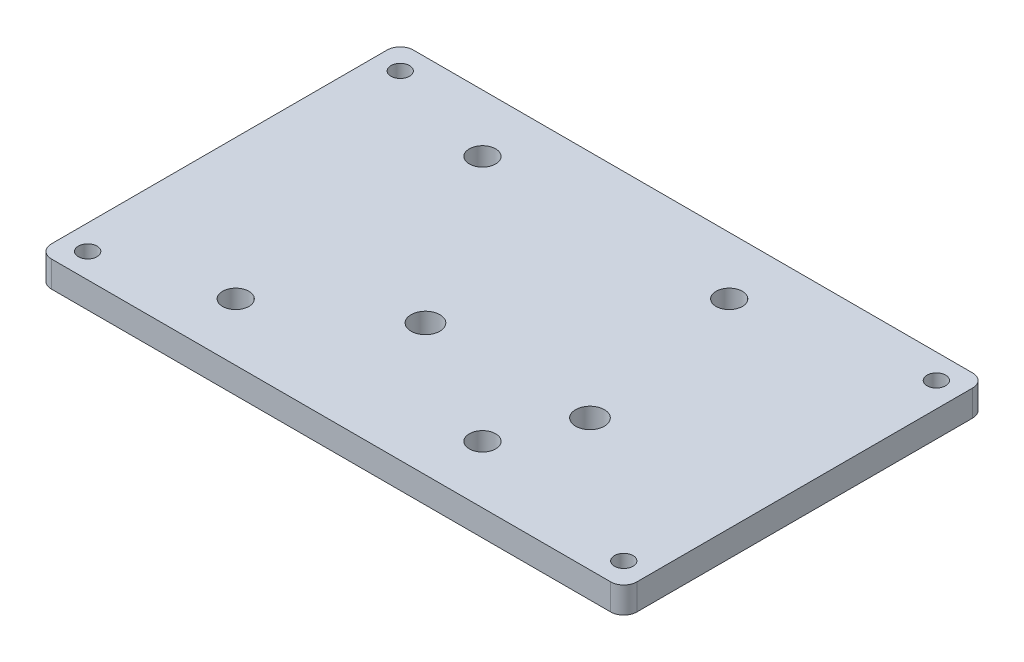
ISO-10303-21;
HEADER;
FILE_DESCRIPTION(('STEP AP214'),'2;1');
FILE_NAME('part.step','',(''),(''),'','','');
FILE_SCHEMA(('AUTOMOTIVE_DESIGN { 1 0 10303 214 1 1 1 1 }'));
ENDSEC;
DATA;
#1=APPLICATION_CONTEXT('core data for automotive mechanical design processes');
#2=APPLICATION_PROTOCOL_DEFINITION('international standard','automotive_design',2000,#1);
#3=PRODUCT_CONTEXT('',#1,'mechanical');
#4=PRODUCT('Part','Part','',(#3));
#5=PRODUCT_RELATED_PRODUCT_CATEGORY('part','',(#4));
#6=PRODUCT_DEFINITION_FORMATION('','',#4);
#7=PRODUCT_DEFINITION_CONTEXT('part definition',#1,'design');
#8=PRODUCT_DEFINITION('design','',#6,#7);
#9=PRODUCT_DEFINITION_SHAPE('','',#8);
#10=(LENGTH_UNIT() NAMED_UNIT(*) SI_UNIT(.MILLI.,.METRE.));
#11=(NAMED_UNIT(*) PLANE_ANGLE_UNIT() SI_UNIT($,.RADIAN.));
#12=(NAMED_UNIT(*) SI_UNIT($,.STERADIAN.) SOLID_ANGLE_UNIT());
#13=UNCERTAINTY_MEASURE_WITH_UNIT(LENGTH_MEASURE(1.E-05),#10,'distance_accuracy_value','');
#14=(GEOMETRIC_REPRESENTATION_CONTEXT(3) GLOBAL_UNCERTAINTY_ASSIGNED_CONTEXT((#13)) GLOBAL_UNIT_ASSIGNED_CONTEXT((#10,
#11,#12)) REPRESENTATION_CONTEXT('',''));
#15=CARTESIAN_POINT('',(0.,0.,0.));
#16=DIRECTION('',(0.,0.,1.));
#17=DIRECTION('',(1.,0.,0.));
#18=AXIS2_PLACEMENT_3D('',#15,#16,#17);
#19=CARTESIAN_POINT('',(0.,3.175,44.));
#20=DIRECTION('',(0.,0.,-1.));
#21=DIRECTION('',(-1.,0.,0.));
#22=AXIS2_PLACEMENT_3D('',#19,#20,#21);
#23=PLANE('',#22);
#24=DIRECTION('',(1.,0.,0.));
#25=VECTOR('',#24,1.);
#26=CARTESIAN_POINT('',(0.,0.,44.));
#27=LINE('',#26,#25);
#28=CARTESIAN_POINT('',(-8.4125,0.,44.));
#29=VERTEX_POINT('',#28);
#30=CARTESIAN_POINT('',(59.5925,0.,44.));
#31=VERTEX_POINT('',#30);
#32=EDGE_CURVE('E136',#29,#31,#27,.T.);
#33=ORIENTED_EDGE('',*,*,#32,.T.);
#34=DIRECTION('',(0.,1.,0.));
#35=VECTOR('',#34,1.);
#36=CARTESIAN_POINT('',(59.5925,3.175,44.));
#37=LINE('',#36,#35);
#38=CARTESIAN_POINT('',(59.5925,3.175,44.));
#39=VERTEX_POINT('',#38);
#40=EDGE_CURVE('E11',#31,#39,#37,.T.);
#41=ORIENTED_EDGE('',*,*,#40,.T.);
#42=DIRECTION('',(1.,0.,0.));
#43=VECTOR('',#42,1.);
#44=CARTESIAN_POINT('',(0.,3.175,44.));
#45=LINE('',#44,#43);
#46=CARTESIAN_POINT('',(-8.4125,3.175,44.));
#47=VERTEX_POINT('',#46);
#48=EDGE_CURVE('E185',#47,#39,#45,.T.);
#49=ORIENTED_EDGE('',*,*,#48,.F.);
#50=DIRECTION('',(0.,1.,0.));
#51=VECTOR('',#50,1.);
#52=CARTESIAN_POINT('',(-8.4125,0.,44.));
#53=LINE('',#52,#51);
#54=EDGE_CURVE('E57',#47,#29,#53,.F.);
#55=ORIENTED_EDGE('',*,*,#54,.T.);
#56=EDGE_LOOP('',(#33,#41,#49,#55));
#57=FACE_BOUND('',#56,.T.);
#58=ADVANCED_FACE('F48',(#57),#23,.F.);
#59=CARTESIAN_POINT('',(0.,3.175,0.));
#60=DIRECTION('',(0.,0.,-1.));
#61=DIRECTION('',(-1.,0.,0.));
#62=AXIS2_PLACEMENT_3D('',#59,#60,#61);
#63=PLANE('',#62);
#64=DIRECTION('',(1.,0.,0.));
#65=VECTOR('',#64,1.);
#66=CARTESIAN_POINT('',(0.,0.,0.));
#67=LINE('',#66,#65);
#68=CARTESIAN_POINT('',(-8.41250000000001,0.,0.));
#69=VERTEX_POINT('',#68);
#70=CARTESIAN_POINT('',(59.5925,0.,0.));
#71=VERTEX_POINT('',#70);
#72=EDGE_CURVE('E118',#69,#71,#67,.T.);
#73=ORIENTED_EDGE('',*,*,#72,.F.);
#74=DIRECTION('',(0.,1.,0.));
#75=VECTOR('',#74,1.);
#76=CARTESIAN_POINT('',(-8.41250000000001,3.175,0.));
#77=LINE('',#76,#75);
#78=CARTESIAN_POINT('',(-8.41250000000001,3.175,0.));
#79=VERTEX_POINT('',#78);
#80=EDGE_CURVE('E130',#69,#79,#77,.T.);
#81=ORIENTED_EDGE('',*,*,#80,.T.);
#82=DIRECTION('',(1.,0.,0.));
#83=VECTOR('',#82,1.);
#84=CARTESIAN_POINT('',(0.,3.175,0.));
#85=LINE('',#84,#83);
#86=CARTESIAN_POINT('',(59.5925,3.175,0.));
#87=VERTEX_POINT('',#86);
#88=EDGE_CURVE('E147',#79,#87,#85,.T.);
#89=ORIENTED_EDGE('',*,*,#88,.T.);
#90=DIRECTION('',(0.,1.,0.));
#91=VECTOR('',#90,1.);
#92=CARTESIAN_POINT('',(59.5925,0.,0.));
#93=LINE('',#92,#91);
#94=EDGE_CURVE('E133',#87,#71,#93,.F.);
#95=ORIENTED_EDGE('',*,*,#94,.T.);
#96=EDGE_LOOP('',(#73,#81,#89,#95));
#97=FACE_BOUND('',#96,.T.);
#98=ADVANCED_FACE('F128',(#97),#63,.T.);
#99=CARTESIAN_POINT('',(7.,3.175,7.));
#100=DIRECTION('',(0.,-1.,0.));
#101=DIRECTION('',(0.,0.,-1.));
#102=AXIS2_PLACEMENT_3D('',#99,#100,#101);
#103=CYLINDRICAL_SURFACE('',#102,1.6);
#104=CARTESIAN_POINT('',(7.,3.175,7.));
#105=DIRECTION('',(0.,1.,0.));
#106=DIRECTION('',(0.,0.,1.));
#107=AXIS2_PLACEMENT_3D('',#104,#105,#106);
#108=CIRCLE('',#107,1.6);
#109=CARTESIAN_POINT('',(7.,3.175,8.6));
#110=VERTEX_POINT('',#109);
#111=EDGE_CURVE('E230',#110,#110,#108,.T.);
#112=ORIENTED_EDGE('',*,*,#111,.T.);
#113=EDGE_LOOP('',(#112));
#114=FACE_BOUND('',#113,.T.);
#115=CARTESIAN_POINT('',(7.,0.,7.));
#116=DIRECTION('',(0.,1.,0.));
#117=DIRECTION('',(0.,0.,1.));
#118=AXIS2_PLACEMENT_3D('',#115,#116,#117);
#119=CIRCLE('',#118,1.6);
#120=CARTESIAN_POINT('',(7.,0.,8.6));
#121=VERTEX_POINT('',#120);
#122=EDGE_CURVE('E190',#121,#121,#119,.T.);
#123=ORIENTED_EDGE('',*,*,#122,.F.);
#124=EDGE_LOOP('',(#123));
#125=FACE_BOUND('',#124,.T.);
#126=ADVANCED_FACE('F262',(#114,#125),#103,.F.);
#127=CARTESIAN_POINT('',(37.,3.175,7.));
#128=DIRECTION('',(0.,-1.,0.));
#129=DIRECTION('',(0.,0.,-1.));
#130=AXIS2_PLACEMENT_3D('',#127,#128,#129);
#131=CYLINDRICAL_SURFACE('',#130,1.6);
#132=CARTESIAN_POINT('',(37.,3.175,7.));
#133=DIRECTION('',(0.,1.,0.));
#134=DIRECTION('',(0.,0.,1.));
#135=AXIS2_PLACEMENT_3D('',#132,#133,#134);
#136=CIRCLE('',#135,1.6);
#137=CARTESIAN_POINT('',(37.,3.175,8.59999999999999));
#138=VERTEX_POINT('',#137);
#139=EDGE_CURVE('E226',#138,#138,#136,.T.);
#140=ORIENTED_EDGE('',*,*,#139,.T.);
#141=EDGE_LOOP('',(#140));
#142=FACE_BOUND('',#141,.T.);
#143=CARTESIAN_POINT('',(37.,0.,7.));
#144=DIRECTION('',(0.,1.,0.));
#145=DIRECTION('',(0.,0.,1.));
#146=AXIS2_PLACEMENT_3D('',#143,#144,#145);
#147=CIRCLE('',#146,1.6);
#148=CARTESIAN_POINT('',(37.,0.,8.59999999999999));
#149=VERTEX_POINT('',#148);
#150=EDGE_CURVE('E253',#149,#149,#147,.T.);
#151=ORIENTED_EDGE('',*,*,#150,.F.);
#152=EDGE_LOOP('',(#151));
#153=FACE_BOUND('',#152,.T.);
#154=ADVANCED_FACE('F264',(#142,#153),#131,.F.);
#155=CARTESIAN_POINT('',(37.,3.175,37.));
#156=DIRECTION('',(0.,-1.,0.));
#157=DIRECTION('',(0.,0.,-1.));
#158=AXIS2_PLACEMENT_3D('',#155,#156,#157);
#159=CYLINDRICAL_SURFACE('',#158,1.6);
#160=CARTESIAN_POINT('',(37.,3.175,37.));
#161=DIRECTION('',(0.,1.,0.));
#162=DIRECTION('',(0.,0.,1.));
#163=AXIS2_PLACEMENT_3D('',#160,#161,#162);
#164=CIRCLE('',#163,1.6);
#165=CARTESIAN_POINT('',(37.,3.175,38.6));
#166=VERTEX_POINT('',#165);
#167=EDGE_CURVE('E222',#166,#166,#164,.T.);
#168=ORIENTED_EDGE('',*,*,#167,.T.);
#169=EDGE_LOOP('',(#168));
#170=FACE_BOUND('',#169,.T.);
#171=CARTESIAN_POINT('',(37.,0.,37.));
#172=DIRECTION('',(0.,1.,0.));
#173=DIRECTION('',(0.,0.,1.));
#174=AXIS2_PLACEMENT_3D('',#171,#172,#173);
#175=CIRCLE('',#174,1.6);
#176=CARTESIAN_POINT('',(37.,0.,38.6));
#177=VERTEX_POINT('',#176);
#178=EDGE_CURVE('E249',#177,#177,#175,.T.);
#179=ORIENTED_EDGE('',*,*,#178,.F.);
#180=EDGE_LOOP('',(#179));
#181=FACE_BOUND('',#180,.T.);
#182=ADVANCED_FACE('F271',(#170,#181),#159,.F.);
#183=CARTESIAN_POINT('',(7.,3.175,37.));
#184=DIRECTION('',(0.,-1.,0.));
#185=DIRECTION('',(0.,0.,-1.));
#186=AXIS2_PLACEMENT_3D('',#183,#184,#185);
#187=CYLINDRICAL_SURFACE('',#186,1.6);
#188=CARTESIAN_POINT('',(7.,3.175,37.));
#189=DIRECTION('',(0.,1.,0.));
#190=DIRECTION('',(0.,0.,1.));
#191=AXIS2_PLACEMENT_3D('',#188,#189,#190);
#192=CIRCLE('',#191,1.6);
#193=CARTESIAN_POINT('',(7.,3.175,38.6));
#194=VERTEX_POINT('',#193);
#195=EDGE_CURVE('E218',#194,#194,#192,.T.);
#196=ORIENTED_EDGE('',*,*,#195,.T.);
#197=EDGE_LOOP('',(#196));
#198=FACE_BOUND('',#197,.T.);
#199=CARTESIAN_POINT('',(7.,0.,37.));
#200=DIRECTION('',(0.,1.,0.));
#201=DIRECTION('',(0.,0.,1.));
#202=AXIS2_PLACEMENT_3D('',#199,#200,#201);
#203=CIRCLE('',#202,1.6);
#204=CARTESIAN_POINT('',(7.,0.,38.6));
#205=VERTEX_POINT('',#204);
#206=EDGE_CURVE('E245',#205,#205,#203,.T.);
#207=ORIENTED_EDGE('',*,*,#206,.F.);
#208=EDGE_LOOP('',(#207));
#209=FACE_BOUND('',#208,.T.);
#210=ADVANCED_FACE('F370',(#198,#209),#187,.F.);
#211=CARTESIAN_POINT('',(21.07,3.175,28.));
#212=DIRECTION('',(0.,-1.,0.));
#213=DIRECTION('',(0.,0.,-1.));
#214=AXIS2_PLACEMENT_3D('',#211,#212,#213);
#215=CYLINDRICAL_SURFACE('',#214,1.75);
#216=CARTESIAN_POINT('',(21.07,3.175,28.));
#217=DIRECTION('',(0.,1.,0.));
#218=DIRECTION('',(0.,0.,1.));
#219=AXIS2_PLACEMENT_3D('',#216,#217,#218);
#220=CIRCLE('',#219,1.75);
#221=CARTESIAN_POINT('',(21.07,3.175,29.75));
#222=VERTEX_POINT('',#221);
#223=EDGE_CURVE('E214',#222,#222,#220,.T.);
#224=ORIENTED_EDGE('',*,*,#223,.T.);
#225=EDGE_LOOP('',(#224));
#226=FACE_BOUND('',#225,.T.);
#227=CARTESIAN_POINT('',(21.07,0.,28.));
#228=DIRECTION('',(0.,1.,0.));
#229=DIRECTION('',(0.,0.,1.));
#230=AXIS2_PLACEMENT_3D('',#227,#228,#229);
#231=CIRCLE('',#230,1.75);
#232=CARTESIAN_POINT('',(21.07,0.,29.75));
#233=VERTEX_POINT('',#232);
#234=EDGE_CURVE('E241',#233,#233,#231,.T.);
#235=ORIENTED_EDGE('',*,*,#234,.F.);
#236=EDGE_LOOP('',(#235));
#237=FACE_BOUND('',#236,.T.);
#238=ADVANCED_FACE('F366',(#226,#237),#215,.F.);
#239=CARTESIAN_POINT('',(41.07,3.175,28.));
#240=DIRECTION('',(0.,-1.,0.));
#241=DIRECTION('',(0.,0.,-1.));
#242=AXIS2_PLACEMENT_3D('',#239,#240,#241);
#243=CYLINDRICAL_SURFACE('',#242,1.75);
#244=CARTESIAN_POINT('',(41.07,3.175,28.));
#245=DIRECTION('',(0.,1.,0.));
#246=DIRECTION('',(0.,0.,1.));
#247=AXIS2_PLACEMENT_3D('',#244,#245,#246);
#248=CIRCLE('',#247,1.75);
#249=CARTESIAN_POINT('',(41.07,3.175,29.75));
#250=VERTEX_POINT('',#249);
#251=EDGE_CURVE('E135',#250,#250,#248,.T.);
#252=ORIENTED_EDGE('',*,*,#251,.T.);
#253=EDGE_LOOP('',(#252));
#254=FACE_BOUND('',#253,.T.);
#255=CARTESIAN_POINT('',(41.07,0.,28.));
#256=DIRECTION('',(0.,1.,0.));
#257=DIRECTION('',(0.,0.,1.));
#258=AXIS2_PLACEMENT_3D('',#255,#256,#257);
#259=CIRCLE('',#258,1.75);
#260=CARTESIAN_POINT('',(41.07,0.,29.75));
#261=VERTEX_POINT('',#260);
#262=EDGE_CURVE('E205',#261,#261,#259,.T.);
#263=ORIENTED_EDGE('',*,*,#262,.F.);
#264=EDGE_LOOP('',(#263));
#265=FACE_BOUND('',#264,.T.);
#266=ADVANCED_FACE('F287',(#254,#265),#243,.F.);
#267=CARTESIAN_POINT('',(0.,3.175,0.));
#268=DIRECTION('',(0.,1.,0.));
#269=DIRECTION('',(0.,0.,1.));
#270=AXIS2_PLACEMENT_3D('',#267,#268,#269);
#271=PLANE('',#270);
#272=CARTESIAN_POINT('',(-7.00000000000001,3.175,3.));
#273=DIRECTION('',(0.,1.,0.));
#274=DIRECTION('',(0.,0.,1.));
#275=AXIS2_PLACEMENT_3D('',#272,#273,#274);
#276=CIRCLE('',#275,1.1303);
#277=CARTESIAN_POINT('',(-7.00000000000001,3.175,4.1303));
#278=VERTEX_POINT('',#277);
#279=EDGE_CURVE('E320',#278,#278,#276,.T.);
#280=ORIENTED_EDGE('',*,*,#279,.F.);
#281=EDGE_LOOP('',(#280));
#282=FACE_BOUND('',#281,.T.);
#283=CARTESIAN_POINT('',(-7.00000000000001,3.175,41.));
#284=DIRECTION('',(0.,1.,0.));
#285=DIRECTION('',(0.,0.,1.));
#286=AXIS2_PLACEMENT_3D('',#283,#284,#285);
#287=CIRCLE('',#286,1.1303);
#288=CARTESIAN_POINT('',(-7.00000000000001,3.175,42.1303));
#289=VERTEX_POINT('',#288);
#290=EDGE_CURVE('E324',#289,#289,#287,.T.);
#291=ORIENTED_EDGE('',*,*,#290,.F.);
#292=EDGE_LOOP('',(#291));
#293=FACE_BOUND('',#292,.T.);
#294=CARTESIAN_POINT('',(58.18,3.175,3.));
#295=DIRECTION('',(0.,1.,0.));
#296=DIRECTION('',(0.,0.,1.));
#297=AXIS2_PLACEMENT_3D('',#294,#295,#296);
#298=CIRCLE('',#297,1.1303);
#299=CARTESIAN_POINT('',(58.18,3.175,4.1303));
#300=VERTEX_POINT('',#299);
#301=EDGE_CURVE('E334',#300,#300,#298,.T.);
#302=ORIENTED_EDGE('',*,*,#301,.F.);
#303=EDGE_LOOP('',(#302));
#304=FACE_BOUND('',#303,.T.);
#305=CARTESIAN_POINT('',(58.18,3.175,41.));
#306=DIRECTION('',(0.,1.,0.));
#307=DIRECTION('',(0.,0.,1.));
#308=AXIS2_PLACEMENT_3D('',#305,#306,#307);
#309=CIRCLE('',#308,1.1303);
#310=CARTESIAN_POINT('',(58.18,3.175,42.1303));
#311=VERTEX_POINT('',#310);
#312=EDGE_CURVE('E342',#311,#311,#309,.T.);
#313=ORIENTED_EDGE('',*,*,#312,.F.);
#314=EDGE_LOOP('',(#313));
#315=FACE_BOUND('',#314,.T.);
#316=ORIENTED_EDGE('',*,*,#251,.F.);
#317=EDGE_LOOP('',(#316));
#318=FACE_BOUND('',#317,.T.);
#319=ORIENTED_EDGE('',*,*,#223,.F.);
#320=EDGE_LOOP('',(#319));
#321=FACE_BOUND('',#320,.T.);
#322=ORIENTED_EDGE('',*,*,#195,.F.);
#323=EDGE_LOOP('',(#322));
#324=FACE_BOUND('',#323,.T.);
#325=ORIENTED_EDGE('',*,*,#167,.F.);
#326=EDGE_LOOP('',(#325));
#327=FACE_BOUND('',#326,.T.);
#328=ORIENTED_EDGE('',*,*,#139,.F.);
#329=EDGE_LOOP('',(#328));
#330=FACE_BOUND('',#329,.T.);
#331=ORIENTED_EDGE('',*,*,#111,.F.);
#332=EDGE_LOOP('',(#331));
#333=FACE_BOUND('',#332,.T.);
#334=ORIENTED_EDGE('',*,*,#88,.F.);
#335=CARTESIAN_POINT('',(-8.41250000000001,3.175,1.5875));
#336=DIRECTION('',(0.,1.,0.));
#337=DIRECTION('',(0.,0.,1.));
#338=AXIS2_PLACEMENT_3D('',#335,#336,#337);
#339=CIRCLE('',#338,1.5875);
#340=CARTESIAN_POINT('',(-10.,3.175,1.5875));
#341=VERTEX_POINT('',#340);
#342=EDGE_CURVE('E139',#79,#341,#339,.T.);
#343=ORIENTED_EDGE('',*,*,#342,.T.);
#344=DIRECTION('',(0.,0.,1.));
#345=VECTOR('',#344,1.);
#346=CARTESIAN_POINT('',(-10.,3.175,0.));
#347=LINE('',#346,#345);
#348=CARTESIAN_POINT('',(-10.,3.175,42.4125));
#349=VERTEX_POINT('',#348);
#350=EDGE_CURVE('E197',#341,#349,#347,.T.);
#351=ORIENTED_EDGE('',*,*,#350,.T.);
#352=CARTESIAN_POINT('',(-8.4125,3.175,42.4125));
#353=DIRECTION('',(0.,1.,0.));
#354=DIRECTION('',(0.,0.,1.));
#355=AXIS2_PLACEMENT_3D('',#352,#353,#354);
#356=CIRCLE('',#355,1.5875);
#357=EDGE_CURVE('E141',#349,#47,#356,.T.);
#358=ORIENTED_EDGE('',*,*,#357,.T.);
#359=ORIENTED_EDGE('',*,*,#48,.T.);
#360=CARTESIAN_POINT('',(59.5925,3.175,42.4125));
#361=DIRECTION('',(0.,1.,0.));
#362=DIRECTION('',(0.,0.,1.));
#363=AXIS2_PLACEMENT_3D('',#360,#361,#362);
#364=CIRCLE('',#363,1.5875);
#365=CARTESIAN_POINT('',(61.18,3.175,42.4125));
#366=VERTEX_POINT('',#365);
#367=EDGE_CURVE('E145',#39,#366,#364,.T.);
#368=ORIENTED_EDGE('',*,*,#367,.T.);
#369=DIRECTION('',(0.,0.,1.));
#370=VECTOR('',#369,1.);
#371=CARTESIAN_POINT('',(61.18,3.175,0.));
#372=LINE('',#371,#370);
#373=CARTESIAN_POINT('',(61.18,3.175,1.5875));
#374=VERTEX_POINT('',#373);
#375=EDGE_CURVE('E207',#374,#366,#372,.T.);
#376=ORIENTED_EDGE('',*,*,#375,.F.);
#377=CARTESIAN_POINT('',(59.5925,3.175,1.5875));
#378=DIRECTION('',(0.,1.,0.));
#379=DIRECTION('',(0.,0.,1.));
#380=AXIS2_PLACEMENT_3D('',#377,#378,#379);
#381=CIRCLE('',#380,1.5875);
#382=EDGE_CURVE('E152',#374,#87,#381,.T.);
#383=ORIENTED_EDGE('',*,*,#382,.T.);
#384=EDGE_LOOP('',(#334,#343,#351,#358,#359,#368,#376,#383));
#385=FACE_BOUND('',#384,.T.);
#386=ADVANCED_FACE('F199',(#282,#293,#304,#315,#318,#321,#324,#327,#330,#333,#385),#271,.T.);
#387=CARTESIAN_POINT('',(0.,0.,0.));
#388=DIRECTION('',(0.,1.,0.));
#389=DIRECTION('',(0.,0.,1.));
#390=AXIS2_PLACEMENT_3D('',#387,#388,#389);
#391=PLANE('',#390);
#392=CARTESIAN_POINT('',(-7.00000000000001,0.,3.));
#393=DIRECTION('',(0.,1.,0.));
#394=DIRECTION('',(0.,0.,1.));
#395=AXIS2_PLACEMENT_3D('',#392,#393,#394);
#396=CIRCLE('',#395,1.1303);
#397=CARTESIAN_POINT('',(-7.00000000000001,0.,4.1303));
#398=VERTEX_POINT('',#397);
#399=EDGE_CURVE('E317',#398,#398,#396,.T.);
#400=ORIENTED_EDGE('',*,*,#399,.T.);
#401=EDGE_LOOP('',(#400));
#402=FACE_BOUND('',#401,.T.);
#403=CARTESIAN_POINT('',(-7.00000000000001,0.,41.));
#404=DIRECTION('',(0.,1.,0.));
#405=DIRECTION('',(0.,0.,1.));
#406=AXIS2_PLACEMENT_3D('',#403,#404,#405);
#407=CIRCLE('',#406,1.1303);
#408=CARTESIAN_POINT('',(-7.00000000000001,0.,42.1303));
#409=VERTEX_POINT('',#408);
#410=EDGE_CURVE('E330',#409,#409,#407,.T.);
#411=ORIENTED_EDGE('',*,*,#410,.T.);
#412=EDGE_LOOP('',(#411));
#413=FACE_BOUND('',#412,.T.);
#414=CARTESIAN_POINT('',(58.18,0.,3.));
#415=DIRECTION('',(0.,1.,0.));
#416=DIRECTION('',(0.,0.,1.));
#417=AXIS2_PLACEMENT_3D('',#414,#415,#416);
#418=CIRCLE('',#417,1.1303);
#419=CARTESIAN_POINT('',(58.18,0.,4.1303));
#420=VERTEX_POINT('',#419);
#421=EDGE_CURVE('E338',#420,#420,#418,.T.);
#422=ORIENTED_EDGE('',*,*,#421,.T.);
#423=EDGE_LOOP('',(#422));
#424=FACE_BOUND('',#423,.T.);
#425=CARTESIAN_POINT('',(58.18,0.,41.));
#426=DIRECTION('',(0.,1.,0.));
#427=DIRECTION('',(0.,0.,1.));
#428=AXIS2_PLACEMENT_3D('',#425,#426,#427);
#429=CIRCLE('',#428,1.1303);
#430=CARTESIAN_POINT('',(58.18,0.,42.1303));
#431=VERTEX_POINT('',#430);
#432=EDGE_CURVE('E346',#431,#431,#429,.T.);
#433=ORIENTED_EDGE('',*,*,#432,.T.);
#434=EDGE_LOOP('',(#433));
#435=FACE_BOUND('',#434,.T.);
#436=ORIENTED_EDGE('',*,*,#262,.T.);
#437=EDGE_LOOP('',(#436));
#438=FACE_BOUND('',#437,.T.);
#439=ORIENTED_EDGE('',*,*,#234,.T.);
#440=EDGE_LOOP('',(#439));
#441=FACE_BOUND('',#440,.T.);
#442=ORIENTED_EDGE('',*,*,#206,.T.);
#443=EDGE_LOOP('',(#442));
#444=FACE_BOUND('',#443,.T.);
#445=ORIENTED_EDGE('',*,*,#178,.T.);
#446=EDGE_LOOP('',(#445));
#447=FACE_BOUND('',#446,.T.);
#448=ORIENTED_EDGE('',*,*,#150,.T.);
#449=EDGE_LOOP('',(#448));
#450=FACE_BOUND('',#449,.T.);
#451=ORIENTED_EDGE('',*,*,#122,.T.);
#452=EDGE_LOOP('',(#451));
#453=FACE_BOUND('',#452,.T.);
#454=DIRECTION('',(0.,0.,-1.));
#455=VECTOR('',#454,1.);
#456=CARTESIAN_POINT('',(-10.,0.,0.));
#457=LINE('',#456,#455);
#458=CARTESIAN_POINT('',(-10.,0.,42.4125));
#459=VERTEX_POINT('',#458);
#460=CARTESIAN_POINT('',(-10.,0.,1.5875));
#461=VERTEX_POINT('',#460);
#462=EDGE_CURVE('E120',#459,#461,#457,.T.);
#463=ORIENTED_EDGE('',*,*,#462,.T.);
#464=CARTESIAN_POINT('',(-8.41250000000001,0.,1.5875));
#465=DIRECTION('',(0.,1.,0.));
#466=DIRECTION('',(0.,0.,1.));
#467=AXIS2_PLACEMENT_3D('',#464,#465,#466);
#468=CIRCLE('',#467,1.5875);
#469=EDGE_CURVE('E115',#461,#69,#468,.F.);
#470=ORIENTED_EDGE('',*,*,#469,.T.);
#471=ORIENTED_EDGE('',*,*,#72,.T.);
#472=CARTESIAN_POINT('',(59.5925,0.,1.5875));
#473=DIRECTION('',(0.,1.,0.));
#474=DIRECTION('',(0.,0.,1.));
#475=AXIS2_PLACEMENT_3D('',#472,#473,#474);
#476=CIRCLE('',#475,1.5875);
#477=CARTESIAN_POINT('',(61.18,0.,1.5875));
#478=VERTEX_POINT('',#477);
#479=EDGE_CURVE('E64',#71,#478,#476,.F.);
#480=ORIENTED_EDGE('',*,*,#479,.T.);
#481=DIRECTION('',(0.,0.,-1.));
#482=VECTOR('',#481,1.);
#483=CARTESIAN_POINT('',(61.18,0.,0.));
#484=LINE('',#483,#482);
#485=CARTESIAN_POINT('',(61.18,0.,42.4125));
#486=VERTEX_POINT('',#485);
#487=EDGE_CURVE('E201',#486,#478,#484,.T.);
#488=ORIENTED_EDGE('',*,*,#487,.F.);
#489=CARTESIAN_POINT('',(59.5925,0.,42.4125));
#490=DIRECTION('',(0.,1.,0.));
#491=DIRECTION('',(0.,0.,1.));
#492=AXIS2_PLACEMENT_3D('',#489,#490,#491);
#493=CIRCLE('',#492,1.5875);
#494=EDGE_CURVE('E167',#486,#31,#493,.F.);
#495=ORIENTED_EDGE('',*,*,#494,.T.);
#496=ORIENTED_EDGE('',*,*,#32,.F.);
#497=CARTESIAN_POINT('',(-8.4125,0.,42.4125));
#498=DIRECTION('',(0.,1.,0.));
#499=DIRECTION('',(0.,0.,1.));
#500=AXIS2_PLACEMENT_3D('',#497,#498,#499);
#501=CIRCLE('',#500,1.5875);
#502=EDGE_CURVE('E164',#29,#459,#501,.F.);
#503=ORIENTED_EDGE('',*,*,#502,.T.);
#504=EDGE_LOOP('',(#463,#470,#471,#480,#488,#495,#496,#503));
#505=FACE_BOUND('',#504,.T.);
#506=ADVANCED_FACE('F117',(#402,#413,#424,#435,#438,#441,#444,#447,#450,#453,#505),#391,.F.);
#507=CARTESIAN_POINT('',(-10.,-45.1220566907139,0.));
#508=DIRECTION('',(-1.,0.,0.));
#509=DIRECTION('',(0.,0.,1.));
#510=AXIS2_PLACEMENT_3D('',#507,#508,#509);
#511=PLANE('',#510);
#512=ORIENTED_EDGE('',*,*,#350,.F.);
#513=DIRECTION('',(0.,1.,0.));
#514=VECTOR('',#513,1.);
#515=CARTESIAN_POINT('',(-10.,-45.1220566907139,1.5875));
#516=LINE('',#515,#514);
#517=EDGE_CURVE('E161',#341,#461,#516,.F.);
#518=ORIENTED_EDGE('',*,*,#517,.T.);
#519=ORIENTED_EDGE('',*,*,#462,.F.);
#520=DIRECTION('',(0.,1.,0.));
#521=VECTOR('',#520,1.);
#522=CARTESIAN_POINT('',(-10.,3.175,42.4125));
#523=LINE('',#522,#521);
#524=EDGE_CURVE('E157',#459,#349,#523,.T.);
#525=ORIENTED_EDGE('',*,*,#524,.T.);
#526=EDGE_LOOP('',(#512,#518,#519,#525));
#527=FACE_BOUND('',#526,.T.);
#528=ADVANCED_FACE('F196',(#527),#511,.T.);
#529=CARTESIAN_POINT('',(61.18,-45.1220566907139,0.));
#530=DIRECTION('',(-1.,0.,0.));
#531=DIRECTION('',(0.,0.,1.));
#532=AXIS2_PLACEMENT_3D('',#529,#530,#531);
#533=PLANE('',#532);
#534=ORIENTED_EDGE('',*,*,#487,.T.);
#535=DIRECTION('',(0.,1.,0.));
#536=VECTOR('',#535,1.);
#537=CARTESIAN_POINT('',(61.18,3.175,1.5875));
#538=LINE('',#537,#536);
#539=EDGE_CURVE('E174',#478,#374,#538,.T.);
#540=ORIENTED_EDGE('',*,*,#539,.T.);
#541=ORIENTED_EDGE('',*,*,#375,.T.);
#542=DIRECTION('',(0.,1.,0.));
#543=VECTOR('',#542,1.);
#544=CARTESIAN_POINT('',(61.18,-45.1220566907139,42.4125));
#545=LINE('',#544,#543);
#546=EDGE_CURVE('E71',#366,#486,#545,.F.);
#547=ORIENTED_EDGE('',*,*,#546,.T.);
#548=EDGE_LOOP('',(#534,#540,#541,#547));
#549=FACE_BOUND('',#548,.T.);
#550=ADVANCED_FACE('F291',(#549),#533,.F.);
#551=CARTESIAN_POINT('',(58.18,3.175,41.));
#552=DIRECTION('',(0.,1.,0.));
#553=DIRECTION('',(0.,0.,1.));
#554=AXIS2_PLACEMENT_3D('',#551,#552,#553);
#555=CYLINDRICAL_SURFACE('',#554,1.1303);
#556=ORIENTED_EDGE('',*,*,#432,.F.);
#557=EDGE_LOOP('',(#556));
#558=FACE_BOUND('',#557,.T.);
#559=ORIENTED_EDGE('',*,*,#312,.T.);
#560=EDGE_LOOP('',(#559));
#561=FACE_BOUND('',#560,.T.);
#562=ADVANCED_FACE('F294',(#558,#561),#555,.F.);
#563=CARTESIAN_POINT('',(58.18,3.175,3.));
#564=DIRECTION('',(0.,1.,0.));
#565=DIRECTION('',(0.,0.,1.));
#566=AXIS2_PLACEMENT_3D('',#563,#564,#565);
#567=CYLINDRICAL_SURFACE('',#566,1.1303);
#568=ORIENTED_EDGE('',*,*,#421,.F.);
#569=EDGE_LOOP('',(#568));
#570=FACE_BOUND('',#569,.T.);
#571=ORIENTED_EDGE('',*,*,#301,.T.);
#572=EDGE_LOOP('',(#571));
#573=FACE_BOUND('',#572,.T.);
#574=ADVANCED_FACE('F297',(#570,#573),#567,.F.);
#575=CARTESIAN_POINT('',(-7.00000000000001,3.175,41.));
#576=DIRECTION('',(0.,1.,0.));
#577=DIRECTION('',(0.,0.,1.));
#578=AXIS2_PLACEMENT_3D('',#575,#576,#577);
#579=CYLINDRICAL_SURFACE('',#578,1.1303);
#580=ORIENTED_EDGE('',*,*,#410,.F.);
#581=EDGE_LOOP('',(#580));
#582=FACE_BOUND('',#581,.T.);
#583=ORIENTED_EDGE('',*,*,#290,.T.);
#584=EDGE_LOOP('',(#583));
#585=FACE_BOUND('',#584,.T.);
#586=ADVANCED_FACE('F301',(#582,#585),#579,.F.);
#587=CARTESIAN_POINT('',(-7.00000000000001,3.175,3.));
#588=DIRECTION('',(0.,1.,0.));
#589=DIRECTION('',(0.,0.,1.));
#590=AXIS2_PLACEMENT_3D('',#587,#588,#589);
#591=CYLINDRICAL_SURFACE('',#590,1.1303);
#592=ORIENTED_EDGE('',*,*,#399,.F.);
#593=EDGE_LOOP('',(#592));
#594=FACE_BOUND('',#593,.T.);
#595=ORIENTED_EDGE('',*,*,#279,.T.);
#596=EDGE_LOOP('',(#595));
#597=FACE_BOUND('',#596,.T.);
#598=ADVANCED_FACE('F305',(#594,#597),#591,.F.);
#599=CARTESIAN_POINT('',(-8.41250000000001,3.175,1.5875));
#600=DIRECTION('',(0.,1.,0.));
#601=DIRECTION('',(0.,0.,1.));
#602=AXIS2_PLACEMENT_3D('',#599,#600,#601);
#603=CYLINDRICAL_SURFACE('',#602,1.5875);
#604=ORIENTED_EDGE('',*,*,#469,.F.);
#605=ORIENTED_EDGE('',*,*,#517,.F.);
#606=ORIENTED_EDGE('',*,*,#342,.F.);
#607=ORIENTED_EDGE('',*,*,#80,.F.);
#608=EDGE_LOOP('',(#604,#605,#606,#607));
#609=FACE_BOUND('',#608,.T.);
#610=ADVANCED_FACE('F138',(#609),#603,.T.);
#611=CARTESIAN_POINT('',(59.5925,-45.1220566907139,1.5875));
#612=DIRECTION('',(0.,-1.,0.));
#613=DIRECTION('',(0.,0.,-1.));
#614=AXIS2_PLACEMENT_3D('',#611,#612,#613);
#615=CYLINDRICAL_SURFACE('',#614,1.5875);
#616=ORIENTED_EDGE('',*,*,#479,.F.);
#617=ORIENTED_EDGE('',*,*,#94,.F.);
#618=ORIENTED_EDGE('',*,*,#382,.F.);
#619=ORIENTED_EDGE('',*,*,#539,.F.);
#620=EDGE_LOOP('',(#616,#617,#618,#619));
#621=FACE_BOUND('',#620,.T.);
#622=ADVANCED_FACE('F312',(#621),#615,.T.);
#623=CARTESIAN_POINT('',(59.5925,3.175,42.4125));
#624=DIRECTION('',(0.,1.,0.));
#625=DIRECTION('',(0.,0.,1.));
#626=AXIS2_PLACEMENT_3D('',#623,#624,#625);
#627=CYLINDRICAL_SURFACE('',#626,1.5875);
#628=ORIENTED_EDGE('',*,*,#494,.F.);
#629=ORIENTED_EDGE('',*,*,#546,.F.);
#630=ORIENTED_EDGE('',*,*,#367,.F.);
#631=ORIENTED_EDGE('',*,*,#40,.F.);
#632=EDGE_LOOP('',(#628,#629,#630,#631));
#633=FACE_BOUND('',#632,.T.);
#634=ADVANCED_FACE('F355',(#633),#627,.T.);
#635=CARTESIAN_POINT('',(-8.4125,-45.1220566907139,42.4125));
#636=DIRECTION('',(0.,-1.,0.));
#637=DIRECTION('',(0.,0.,-1.));
#638=AXIS2_PLACEMENT_3D('',#635,#636,#637);
#639=CYLINDRICAL_SURFACE('',#638,1.5875);
#640=ORIENTED_EDGE('',*,*,#502,.F.);
#641=ORIENTED_EDGE('',*,*,#54,.F.);
#642=ORIENTED_EDGE('',*,*,#357,.F.);
#643=ORIENTED_EDGE('',*,*,#524,.F.);
#644=EDGE_LOOP('',(#640,#641,#642,#643));
#645=FACE_BOUND('',#644,.T.);
#646=ADVANCED_FACE('F50',(#645),#639,.T.);
#647=CLOSED_SHELL('',(#58,#98,#126,#154,#182,#210,#238,#266,#386,#506,#528,#550,#562,#574,#586,
#598,#610,#622,#634,#646));
#648=MANIFOLD_SOLID_BREP('B2',#647);
#649=ADVANCED_BREP_SHAPE_REPRESENTATION('',(#18,#648),#14);
#650=SHAPE_DEFINITION_REPRESENTATION(#9,#649);
ENDSEC;
END-ISO-10303-21;
